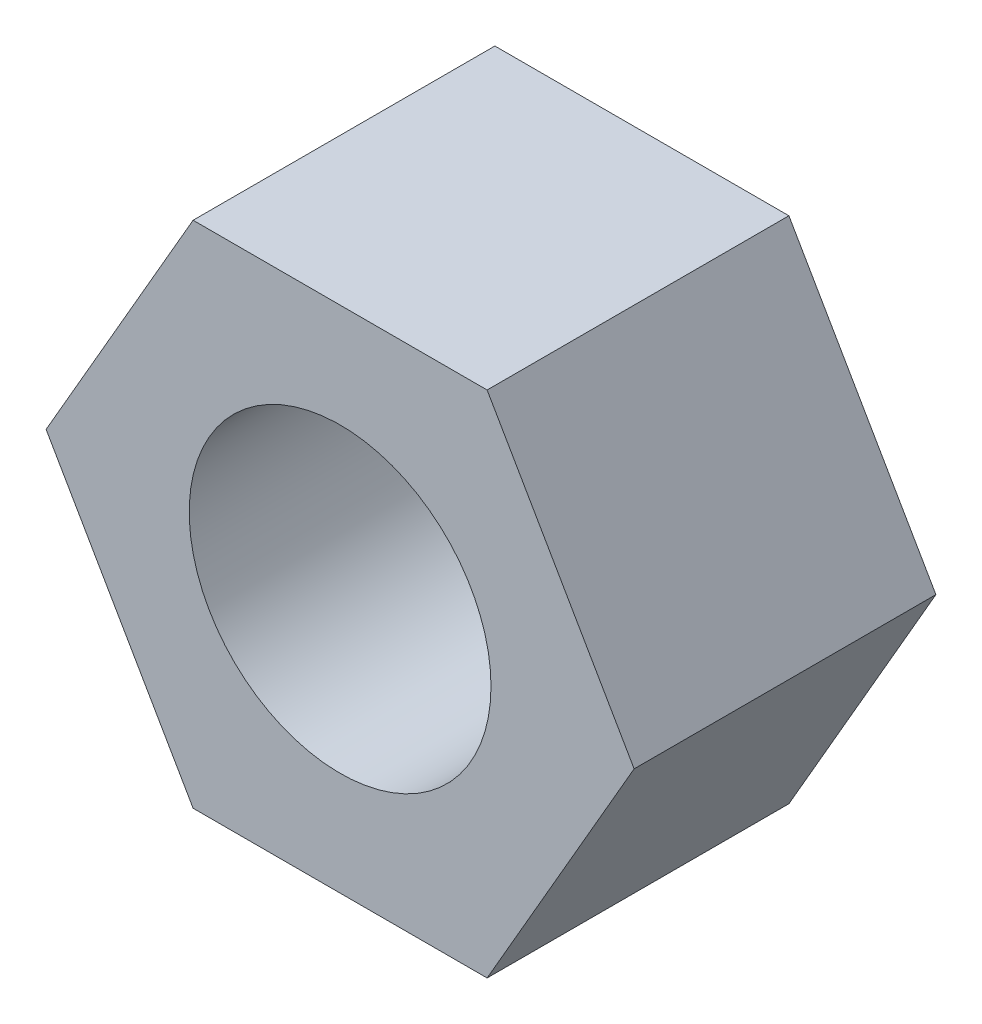
ISO-10303-21;
HEADER;
FILE_DESCRIPTION(('STEP AP214'),'2;1');
FILE_NAME('part.step','',(''),(''),'','','');
FILE_SCHEMA(('AUTOMOTIVE_DESIGN { 1 0 10303 214 1 1 1 1 }'));
ENDSEC;
DATA;
#1=APPLICATION_CONTEXT('core data for automotive mechanical design processes');
#2=APPLICATION_PROTOCOL_DEFINITION('international standard','automotive_design',2000,#1);
#3=PRODUCT_CONTEXT('',#1,'mechanical');
#4=PRODUCT('Part','Part','',(#3));
#5=PRODUCT_RELATED_PRODUCT_CATEGORY('part','',(#4));
#6=PRODUCT_DEFINITION_FORMATION('','',#4);
#7=PRODUCT_DEFINITION_CONTEXT('part definition',#1,'design');
#8=PRODUCT_DEFINITION('design','',#6,#7);
#9=PRODUCT_DEFINITION_SHAPE('','',#8);
#10=(LENGTH_UNIT() NAMED_UNIT(*) SI_UNIT(.MILLI.,.METRE.));
#11=(NAMED_UNIT(*) PLANE_ANGLE_UNIT() SI_UNIT($,.RADIAN.));
#12=(NAMED_UNIT(*) SI_UNIT($,.STERADIAN.) SOLID_ANGLE_UNIT());
#13=UNCERTAINTY_MEASURE_WITH_UNIT(LENGTH_MEASURE(1.E-05),#10,'distance_accuracy_value','');
#14=(GEOMETRIC_REPRESENTATION_CONTEXT(3) GLOBAL_UNCERTAINTY_ASSIGNED_CONTEXT((#13)) GLOBAL_UNIT_ASSIGNED_CONTEXT((#10,
#11,#12)) REPRESENTATION_CONTEXT('',''));
#15=CARTESIAN_POINT('',(0.,0.,0.));
#16=DIRECTION('',(0.,0.,1.));
#17=DIRECTION('',(1.,0.,0.));
#18=AXIS2_PLACEMENT_3D('',#15,#16,#17);
#19=CARTESIAN_POINT('',(0.,0.,8.));
#20=DIRECTION('',(0.,0.,1.));
#21=DIRECTION('',(1.,0.,0.));
#22=AXIS2_PLACEMENT_3D('',#19,#20,#21);
#23=PLANE('',#22);
#24=DIRECTION('',(0.5,0.866025403784439,0.));
#25=VECTOR('',#24,1.);
#26=CARTESIAN_POINT('',(3.89711431702997,-6.75,8.));
#27=LINE('',#26,#25);
#28=CARTESIAN_POINT('',(3.89711431702997,-6.75,8.));
#29=VERTEX_POINT('',#28);
#30=CARTESIAN_POINT('',(7.79422863405995,0.,8.));
#31=VERTEX_POINT('',#30);
#32=EDGE_CURVE('E131',#29,#31,#27,.T.);
#33=ORIENTED_EDGE('',*,*,#32,.T.);
#34=DIRECTION('',(-0.5,0.866025403784438,0.));
#35=VECTOR('',#34,1.);
#36=CARTESIAN_POINT('',(7.79422863405995,0.,8.));
#37=LINE('',#36,#35);
#38=CARTESIAN_POINT('',(3.89711431702997,6.75,8.));
#39=VERTEX_POINT('',#38);
#40=EDGE_CURVE('E89',#31,#39,#37,.T.);
#41=ORIENTED_EDGE('',*,*,#40,.T.);
#42=DIRECTION('',(-1.,0.,0.));
#43=VECTOR('',#42,1.);
#44=CARTESIAN_POINT('',(3.89711431702997,6.75,8.));
#45=LINE('',#44,#43);
#46=CARTESIAN_POINT('',(-3.89711431702998,6.75,8.));
#47=VERTEX_POINT('',#46);
#48=EDGE_CURVE('E102',#39,#47,#45,.T.);
#49=ORIENTED_EDGE('',*,*,#48,.T.);
#50=DIRECTION('',(-0.5,-0.866025403784439,0.));
#51=VECTOR('',#50,1.);
#52=CARTESIAN_POINT('',(-3.89711431702998,6.75,8.));
#53=LINE('',#52,#51);
#54=CARTESIAN_POINT('',(-7.79422863405995,0.,8.));
#55=VERTEX_POINT('',#54);
#56=EDGE_CURVE('E96',#47,#55,#53,.T.);
#57=ORIENTED_EDGE('',*,*,#56,.T.);
#58=DIRECTION('',(0.5,-0.866025403784439,0.));
#59=VECTOR('',#58,1.);
#60=CARTESIAN_POINT('',(-7.79422863405995,0.,8.));
#61=LINE('',#60,#59);
#62=CARTESIAN_POINT('',(-3.89711431702997,-6.75,8.));
#63=VERTEX_POINT('',#62);
#64=EDGE_CURVE('E100',#55,#63,#61,.T.);
#65=ORIENTED_EDGE('',*,*,#64,.T.);
#66=DIRECTION('',(1.,0.,0.));
#67=VECTOR('',#66,1.);
#68=CARTESIAN_POINT('',(-3.89711431702997,-6.75,8.));
#69=LINE('',#68,#67);
#70=EDGE_CURVE('E52',#63,#29,#69,.T.);
#71=ORIENTED_EDGE('',*,*,#70,.T.);
#72=EDGE_LOOP('',(#33,#41,#49,#57,#65,#71));
#73=FACE_BOUND('',#72,.T.);
#74=CARTESIAN_POINT('',(0.,0.,8.));
#75=DIRECTION('',(0.,0.,1.));
#76=DIRECTION('',(1.,0.,0.));
#77=AXIS2_PLACEMENT_3D('',#74,#75,#76);
#78=CIRCLE('',#77,4.);
#79=CARTESIAN_POINT('',(4.,0.,8.));
#80=VERTEX_POINT('',#79);
#81=EDGE_CURVE('E124',#80,#80,#78,.T.);
#82=ORIENTED_EDGE('',*,*,#81,.F.);
#83=EDGE_LOOP('',(#82));
#84=FACE_BOUND('',#83,.T.);
#85=ADVANCED_FACE('F35',(#73,#84),#23,.T.);
#86=CARTESIAN_POINT('',(0.,0.,0.));
#87=DIRECTION('',(0.,0.,1.));
#88=DIRECTION('',(1.,0.,0.));
#89=AXIS2_PLACEMENT_3D('',#86,#87,#88);
#90=PLANE('',#89);
#91=DIRECTION('',(0.5,0.866025403784439,0.));
#92=VECTOR('',#91,1.);
#93=CARTESIAN_POINT('',(3.89711431702997,-6.75,0.));
#94=LINE('',#93,#92);
#95=CARTESIAN_POINT('',(3.89711431702997,-6.75,0.));
#96=VERTEX_POINT('',#95);
#97=CARTESIAN_POINT('',(7.79422863405995,0.,0.));
#98=VERTEX_POINT('',#97);
#99=EDGE_CURVE('E120',#96,#98,#94,.T.);
#100=ORIENTED_EDGE('',*,*,#99,.F.);
#101=DIRECTION('',(1.,0.,0.));
#102=VECTOR('',#101,1.);
#103=CARTESIAN_POINT('',(-3.89711431702997,-6.75,0.));
#104=LINE('',#103,#102);
#105=CARTESIAN_POINT('',(-3.89711431702997,-6.75,0.));
#106=VERTEX_POINT('',#105);
#107=EDGE_CURVE('E81',#106,#96,#104,.T.);
#108=ORIENTED_EDGE('',*,*,#107,.F.);
#109=DIRECTION('',(0.5,-0.866025403784439,0.));
#110=VECTOR('',#109,1.);
#111=CARTESIAN_POINT('',(-7.79422863405995,0.,0.));
#112=LINE('',#111,#110);
#113=CARTESIAN_POINT('',(-7.79422863405995,0.,0.));
#114=VERTEX_POINT('',#113);
#115=EDGE_CURVE('E75',#114,#106,#112,.T.);
#116=ORIENTED_EDGE('',*,*,#115,.F.);
#117=DIRECTION('',(-0.5,-0.866025403784439,0.));
#118=VECTOR('',#117,1.);
#119=CARTESIAN_POINT('',(-3.89711431702998,6.75,0.));
#120=LINE('',#119,#118);
#121=CARTESIAN_POINT('',(-3.89711431702998,6.75,0.));
#122=VERTEX_POINT('',#121);
#123=EDGE_CURVE('E110',#122,#114,#120,.T.);
#124=ORIENTED_EDGE('',*,*,#123,.F.);
#125=DIRECTION('',(-1.,0.,0.));
#126=VECTOR('',#125,1.);
#127=CARTESIAN_POINT('',(3.89711431702997,6.75,0.));
#128=LINE('',#127,#126);
#129=CARTESIAN_POINT('',(3.89711431702997,6.75,0.));
#130=VERTEX_POINT('',#129);
#131=EDGE_CURVE('E126',#130,#122,#128,.T.);
#132=ORIENTED_EDGE('',*,*,#131,.F.);
#133=DIRECTION('',(-0.5,0.866025403784438,0.));
#134=VECTOR('',#133,1.);
#135=CARTESIAN_POINT('',(7.79422863405995,0.,0.));
#136=LINE('',#135,#134);
#137=EDGE_CURVE('E123',#98,#130,#136,.T.);
#138=ORIENTED_EDGE('',*,*,#137,.F.);
#139=EDGE_LOOP('',(#100,#108,#116,#124,#132,#138));
#140=FACE_BOUND('',#139,.T.);
#141=CARTESIAN_POINT('',(0.,0.,0.));
#142=DIRECTION('',(0.,0.,1.));
#143=DIRECTION('',(1.,0.,0.));
#144=AXIS2_PLACEMENT_3D('',#141,#142,#143);
#145=CIRCLE('',#144,4.);
#146=CARTESIAN_POINT('',(4.,0.,0.));
#147=VERTEX_POINT('',#146);
#148=EDGE_CURVE('E224',#147,#147,#145,.T.);
#149=ORIENTED_EDGE('',*,*,#148,.T.);
#150=EDGE_LOOP('',(#149));
#151=FACE_BOUND('',#150,.T.);
#152=ADVANCED_FACE('F140',(#140,#151),#90,.F.);
#153=CARTESIAN_POINT('',(3.89711431702997,-6.75,8.));
#154=DIRECTION('',(-0.866025403784439,0.5,0.));
#155=DIRECTION('',(-0.5,-0.866025403784439,0.));
#156=AXIS2_PLACEMENT_3D('',#153,#154,#155);
#157=PLANE('',#156);
#158=ORIENTED_EDGE('',*,*,#99,.T.);
#159=DIRECTION('',(0.,0.,-1.));
#160=VECTOR('',#159,1.);
#161=CARTESIAN_POINT('',(7.79422863405995,0.,8.));
#162=LINE('',#161,#160);
#163=EDGE_CURVE('E11',#31,#98,#162,.T.);
#164=ORIENTED_EDGE('',*,*,#163,.F.);
#165=ORIENTED_EDGE('',*,*,#32,.F.);
#166=DIRECTION('',(0.,0.,-1.));
#167=VECTOR('',#166,1.);
#168=CARTESIAN_POINT('',(3.89711431702997,-6.75,8.));
#169=LINE('',#168,#167);
#170=EDGE_CURVE('E116',#29,#96,#169,.T.);
#171=ORIENTED_EDGE('',*,*,#170,.T.);
#172=EDGE_LOOP('',(#158,#164,#165,#171));
#173=FACE_BOUND('',#172,.T.);
#174=ADVANCED_FACE('F37',(#173),#157,.F.);
#175=CARTESIAN_POINT('',(7.79422863405995,0.,8.));
#176=DIRECTION('',(-0.866025403784438,-0.5,0.));
#177=DIRECTION('',(0.5,-0.866025403784439,0.));
#178=AXIS2_PLACEMENT_3D('',#175,#176,#177);
#179=PLANE('',#178);
#180=ORIENTED_EDGE('',*,*,#137,.T.);
#181=DIRECTION('',(0.,0.,-1.));
#182=VECTOR('',#181,1.);
#183=CARTESIAN_POINT('',(3.89711431702997,6.75,8.));
#184=LINE('',#183,#182);
#185=EDGE_CURVE('E44',#39,#130,#184,.T.);
#186=ORIENTED_EDGE('',*,*,#185,.F.);
#187=ORIENTED_EDGE('',*,*,#40,.F.);
#188=ORIENTED_EDGE('',*,*,#163,.T.);
#189=EDGE_LOOP('',(#180,#186,#187,#188));
#190=FACE_BOUND('',#189,.T.);
#191=ADVANCED_FACE('F165',(#190),#179,.F.);
#192=CARTESIAN_POINT('',(3.89711431702997,6.75,8.));
#193=DIRECTION('',(0.,-1.,0.));
#194=DIRECTION('',(0.,0.,-1.));
#195=AXIS2_PLACEMENT_3D('',#192,#193,#194);
#196=PLANE('',#195);
#197=ORIENTED_EDGE('',*,*,#131,.T.);
#198=DIRECTION('',(0.,0.,-1.));
#199=VECTOR('',#198,1.);
#200=CARTESIAN_POINT('',(-3.89711431702998,6.75,8.));
#201=LINE('',#200,#199);
#202=EDGE_CURVE('E111',#47,#122,#201,.T.);
#203=ORIENTED_EDGE('',*,*,#202,.F.);
#204=ORIENTED_EDGE('',*,*,#48,.F.);
#205=ORIENTED_EDGE('',*,*,#185,.T.);
#206=EDGE_LOOP('',(#197,#203,#204,#205));
#207=FACE_BOUND('',#206,.T.);
#208=ADVANCED_FACE('F137',(#207),#196,.F.);
#209=CARTESIAN_POINT('',(-3.89711431702998,6.75,8.));
#210=DIRECTION('',(0.866025403784439,-0.5,0.));
#211=DIRECTION('',(0.5,0.866025403784439,0.));
#212=AXIS2_PLACEMENT_3D('',#209,#210,#211);
#213=PLANE('',#212);
#214=ORIENTED_EDGE('',*,*,#123,.T.);
#215=DIRECTION('',(0.,0.,-1.));
#216=VECTOR('',#215,1.);
#217=CARTESIAN_POINT('',(-7.79422863405995,0.,8.));
#218=LINE('',#217,#216);
#219=EDGE_CURVE('E107',#55,#114,#218,.T.);
#220=ORIENTED_EDGE('',*,*,#219,.F.);
#221=ORIENTED_EDGE('',*,*,#56,.F.);
#222=ORIENTED_EDGE('',*,*,#202,.T.);
#223=EDGE_LOOP('',(#214,#220,#221,#222));
#224=FACE_BOUND('',#223,.T.);
#225=ADVANCED_FACE('F108',(#224),#213,.F.);
#226=CARTESIAN_POINT('',(-7.79422863405995,0.,8.));
#227=DIRECTION('',(0.866025403784439,0.5,0.));
#228=DIRECTION('',(-0.5,0.866025403784439,0.));
#229=AXIS2_PLACEMENT_3D('',#226,#227,#228);
#230=PLANE('',#229);
#231=ORIENTED_EDGE('',*,*,#115,.T.);
#232=DIRECTION('',(0.,0.,-1.));
#233=VECTOR('',#232,1.);
#234=CARTESIAN_POINT('',(-3.89711431702997,-6.75,8.));
#235=LINE('',#234,#233);
#236=EDGE_CURVE('E112',#63,#106,#235,.T.);
#237=ORIENTED_EDGE('',*,*,#236,.F.);
#238=ORIENTED_EDGE('',*,*,#64,.F.);
#239=ORIENTED_EDGE('',*,*,#219,.T.);
#240=EDGE_LOOP('',(#231,#237,#238,#239));
#241=FACE_BOUND('',#240,.T.);
#242=ADVANCED_FACE('F114',(#241),#230,.F.);
#243=CARTESIAN_POINT('',(-3.89711431702997,-6.75,8.));
#244=DIRECTION('',(0.,1.,0.));
#245=DIRECTION('',(-1.,0.,0.));
#246=AXIS2_PLACEMENT_3D('',#243,#244,#245);
#247=PLANE('',#246);
#248=ORIENTED_EDGE('',*,*,#107,.T.);
#249=ORIENTED_EDGE('',*,*,#170,.F.);
#250=ORIENTED_EDGE('',*,*,#70,.F.);
#251=ORIENTED_EDGE('',*,*,#236,.T.);
#252=EDGE_LOOP('',(#248,#249,#250,#251));
#253=FACE_BOUND('',#252,.T.);
#254=ADVANCED_FACE('F145',(#253),#247,.F.);
#255=CARTESIAN_POINT('',(0.,0.,8.));
#256=DIRECTION('',(0.,0.,-1.));
#257=DIRECTION('',(-1.,0.,0.));
#258=AXIS2_PLACEMENT_3D('',#255,#256,#257);
#259=CYLINDRICAL_SURFACE('',#258,4.);
#260=ORIENTED_EDGE('',*,*,#81,.T.);
#261=EDGE_LOOP('',(#260));
#262=FACE_BOUND('',#261,.T.);
#263=ORIENTED_EDGE('',*,*,#148,.F.);
#264=EDGE_LOOP('',(#263));
#265=FACE_BOUND('',#264,.T.);
#266=ADVANCED_FACE('F147',(#262,#265),#259,.F.);
#267=CLOSED_SHELL('',(#85,#152,#174,#191,#208,#225,#242,#254,#266));
#268=MANIFOLD_SOLID_BREP('B2',#267);
#269=ADVANCED_BREP_SHAPE_REPRESENTATION('',(#18,#268),#14);
#270=SHAPE_DEFINITION_REPRESENTATION(#9,#269);
ENDSEC;
END-ISO-10303-21;
